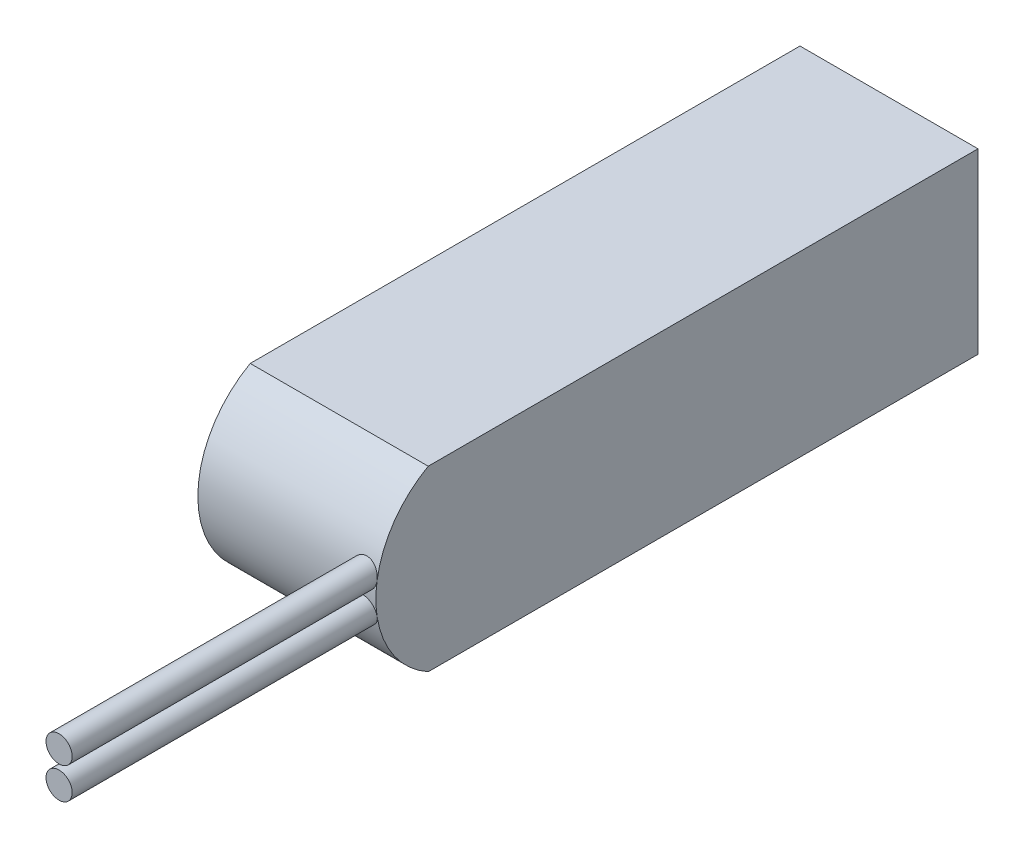
ISO-10303-21;
HEADER;
FILE_DESCRIPTION(('STEP AP214'),'2;1');
FILE_NAME('part.step','',(''),(''),'','','');
FILE_SCHEMA(('AUTOMOTIVE_DESIGN { 1 0 10303 214 1 1 1 1 }'));
ENDSEC;
DATA;
#1=APPLICATION_CONTEXT('core data for automotive mechanical design processes');
#2=APPLICATION_PROTOCOL_DEFINITION('international standard','automotive_design',2000,#1);
#3=PRODUCT_CONTEXT('',#1,'mechanical');
#4=PRODUCT('Part','Part','',(#3));
#5=PRODUCT_RELATED_PRODUCT_CATEGORY('part','',(#4));
#6=PRODUCT_DEFINITION_FORMATION('','',#4);
#7=PRODUCT_DEFINITION_CONTEXT('part definition',#1,'design');
#8=PRODUCT_DEFINITION('design','',#6,#7);
#9=PRODUCT_DEFINITION_SHAPE('','',#8);
#10=(LENGTH_UNIT() NAMED_UNIT(*) SI_UNIT(.MILLI.,.METRE.));
#11=(NAMED_UNIT(*) PLANE_ANGLE_UNIT() SI_UNIT($,.RADIAN.));
#12=(NAMED_UNIT(*) SI_UNIT($,.STERADIAN.) SOLID_ANGLE_UNIT());
#13=UNCERTAINTY_MEASURE_WITH_UNIT(LENGTH_MEASURE(1.E-05),#10,'distance_accuracy_value','');
#14=(GEOMETRIC_REPRESENTATION_CONTEXT(3) GLOBAL_UNCERTAINTY_ASSIGNED_CONTEXT((#13)) GLOBAL_UNIT_ASSIGNED_CONTEXT((#10,
#11,#12)) REPRESENTATION_CONTEXT('',''));
#15=CARTESIAN_POINT('',(0.,0.,0.));
#16=DIRECTION('',(0.,0.,1.));
#17=DIRECTION('',(1.,0.,0.));
#18=AXIS2_PLACEMENT_3D('',#15,#16,#17);
#19=CARTESIAN_POINT('',(0.,0.,105.));
#20=DIRECTION('',(1.,0.,0.));
#21=DIRECTION('',(0.,0.,-1.));
#22=AXIS2_PLACEMENT_3D('',#19,#20,#21);
#23=PLANE('',#22);
#24=DIRECTION('',(0.,-1.,0.));
#25=VECTOR('',#24,1.);
#26=CARTESIAN_POINT('',(0.,0.,0.));
#27=LINE('',#26,#25);
#28=CARTESIAN_POINT('',(0.,34.,0.));
#29=VERTEX_POINT('',#28);
#30=CARTESIAN_POINT('',(0.,0.,0.));
#31=VERTEX_POINT('',#30);
#32=EDGE_CURVE('E112',#29,#31,#27,.T.);
#33=ORIENTED_EDGE('',*,*,#32,.T.);
#34=DIRECTION('',(0.,0.,-1.));
#35=VECTOR('',#34,1.);
#36=CARTESIAN_POINT('',(0.,0.,105.));
#37=LINE('',#36,#35);
#38=CARTESIAN_POINT('',(0.,0.,105.));
#39=VERTEX_POINT('',#38);
#40=EDGE_CURVE('E138',#39,#31,#37,.T.);
#41=ORIENTED_EDGE('',*,*,#40,.F.);
#42=CARTESIAN_POINT('',(0.,17.,95.55));
#43=DIRECTION('',(1.,0.,0.));
#44=DIRECTION('',(0.,0.,-1.));
#45=AXIS2_PLACEMENT_3D('',#42,#43,#44);
#46=CIRCLE('',#45,19.45);
#47=CARTESIAN_POINT('',(0.,34.,105.));
#48=VERTEX_POINT('',#47);
#49=EDGE_CURVE('E111',#48,#39,#46,.T.);
#50=ORIENTED_EDGE('',*,*,#49,.F.);
#51=DIRECTION('',(0.,0.,-1.));
#52=VECTOR('',#51,1.);
#53=CARTESIAN_POINT('',(0.,34.,105.));
#54=LINE('',#53,#52);
#55=EDGE_CURVE('E55',#48,#29,#54,.T.);
#56=ORIENTED_EDGE('',*,*,#55,.T.);
#57=EDGE_LOOP('',(#33,#41,#50,#56));
#58=FACE_BOUND('',#57,.T.);
#59=ADVANCED_FACE('F35',(#58),#23,.F.);
#60=CARTESIAN_POINT('',(0.,0.,105.));
#61=DIRECTION('',(0.,1.,0.));
#62=DIRECTION('',(0.,0.,1.));
#63=AXIS2_PLACEMENT_3D('',#60,#61,#62);
#64=PLANE('',#63);
#65=DIRECTION('',(1.,0.,0.));
#66=VECTOR('',#65,1.);
#67=CARTESIAN_POINT('',(0.,0.,0.));
#68=LINE('',#67,#66);
#69=CARTESIAN_POINT('',(34.,0.,0.));
#70=VERTEX_POINT('',#69);
#71=EDGE_CURVE('E115',#31,#70,#68,.T.);
#72=ORIENTED_EDGE('',*,*,#71,.T.);
#73=DIRECTION('',(0.,0.,-1.));
#74=VECTOR('',#73,1.);
#75=CARTESIAN_POINT('',(34.,0.,105.));
#76=LINE('',#75,#74);
#77=CARTESIAN_POINT('',(34.,0.,105.));
#78=VERTEX_POINT('',#77);
#79=EDGE_CURVE('E142',#78,#70,#76,.T.);
#80=ORIENTED_EDGE('',*,*,#79,.F.);
#81=DIRECTION('',(1.,0.,0.));
#82=VECTOR('',#81,1.);
#83=CARTESIAN_POINT('',(0.,0.,105.));
#84=LINE('',#83,#82);
#85=EDGE_CURVE('E83',#39,#78,#84,.T.);
#86=ORIENTED_EDGE('',*,*,#85,.F.);
#87=ORIENTED_EDGE('',*,*,#40,.T.);
#88=EDGE_LOOP('',(#72,#80,#86,#87));
#89=FACE_BOUND('',#88,.T.);
#90=ADVANCED_FACE('F132',(#89),#64,.F.);
#91=CARTESIAN_POINT('',(34.,0.,105.));
#92=DIRECTION('',(-1.,0.,0.));
#93=DIRECTION('',(0.,0.,1.));
#94=AXIS2_PLACEMENT_3D('',#91,#92,#93);
#95=PLANE('',#94);
#96=CARTESIAN_POINT('',(34.,17.,95.55));
#97=DIRECTION('',(1.,0.,0.));
#98=DIRECTION('',(0.,0.,-1.));
#99=AXIS2_PLACEMENT_3D('',#96,#97,#98);
#100=CIRCLE('',#99,19.45);
#101=CARTESIAN_POINT('',(34.,20.,114.767244859761));
#102=VERTEX_POINT('',#101);
#103=CARTESIAN_POINT('',(34.,14.,114.767244859761));
#104=VERTEX_POINT('',#103);
#105=EDGE_CURVE('E93',#102,#104,#100,.T.);
#106=ORIENTED_EDGE('',*,*,#105,.T.);
#107=EDGE_CURVE('E96',#104,#78,#100,.T.);
#108=ORIENTED_EDGE('',*,*,#107,.T.);
#109=ORIENTED_EDGE('',*,*,#79,.T.);
#110=DIRECTION('',(0.,1.,0.));
#111=VECTOR('',#110,1.);
#112=CARTESIAN_POINT('',(34.,0.,0.));
#113=LINE('',#112,#111);
#114=CARTESIAN_POINT('',(34.,34.,0.));
#115=VERTEX_POINT('',#114);
#116=EDGE_CURVE('E74',#70,#115,#113,.T.);
#117=ORIENTED_EDGE('',*,*,#116,.T.);
#118=DIRECTION('',(0.,0.,-1.));
#119=VECTOR('',#118,1.);
#120=CARTESIAN_POINT('',(34.,34.,105.));
#121=LINE('',#120,#119);
#122=CARTESIAN_POINT('',(34.,34.,105.));
#123=VERTEX_POINT('',#122);
#124=EDGE_CURVE('E145',#123,#115,#121,.T.);
#125=ORIENTED_EDGE('',*,*,#124,.F.);
#126=EDGE_CURVE('E98',#123,#102,#100,.T.);
#127=ORIENTED_EDGE('',*,*,#126,.T.);
#128=EDGE_LOOP('',(#106,#108,#109,#117,#125,#127));
#129=FACE_BOUND('',#128,.T.);
#130=ADVANCED_FACE('F95',(#129),#95,.F.);
#131=CARTESIAN_POINT('',(0.,34.,105.));
#132=DIRECTION('',(0.,-1.,0.));
#133=DIRECTION('',(0.,0.,-1.));
#134=AXIS2_PLACEMENT_3D('',#131,#132,#133);
#135=PLANE('',#134);
#136=DIRECTION('',(-1.,0.,0.));
#137=VECTOR('',#136,1.);
#138=CARTESIAN_POINT('',(0.,34.,0.));
#139=LINE('',#138,#137);
#140=EDGE_CURVE('E77',#115,#29,#139,.T.);
#141=ORIENTED_EDGE('',*,*,#140,.T.);
#142=ORIENTED_EDGE('',*,*,#55,.F.);
#143=DIRECTION('',(-1.,0.,0.));
#144=VECTOR('',#143,1.);
#145=CARTESIAN_POINT('',(0.,34.,105.));
#146=LINE('',#145,#144);
#147=EDGE_CURVE('E246',#123,#48,#146,.T.);
#148=ORIENTED_EDGE('',*,*,#147,.F.);
#149=ORIENTED_EDGE('',*,*,#124,.T.);
#150=EDGE_LOOP('',(#141,#142,#148,#149));
#151=FACE_BOUND('',#150,.T.);
#152=ADVANCED_FACE('F204',(#151),#135,.F.);
#153=CARTESIAN_POINT('',(0.,0.,0.));
#154=DIRECTION('',(0.,0.,-1.));
#155=DIRECTION('',(-1.,0.,0.));
#156=AXIS2_PLACEMENT_3D('',#153,#154,#155);
#157=PLANE('',#156);
#158=ORIENTED_EDGE('',*,*,#140,.F.);
#159=ORIENTED_EDGE('',*,*,#116,.F.);
#160=ORIENTED_EDGE('',*,*,#71,.F.);
#161=ORIENTED_EDGE('',*,*,#32,.F.);
#162=EDGE_LOOP('',(#158,#159,#160,#161));
#163=FACE_BOUND('',#162,.T.);
#164=ADVANCED_FACE('F140',(#163),#157,.T.);
#165=CARTESIAN_POINT('',(0.,17.,95.55));
#166=DIRECTION('',(1.,0.,0.));
#167=DIRECTION('',(0.,0.,-1.));
#168=AXIS2_PLACEMENT_3D('',#165,#166,#167);
#169=CYLINDRICAL_SURFACE('',#168,19.45);
#170=ORIENTED_EDGE('',*,*,#107,.F.);
#171=CARTESIAN_POINT('',(29.,14.,114.767244859761));
#172=CARTESIAN_POINT('',(29.0000062159612,13.857177060345,114.744946476974));
#173=CARTESIAN_POINT('',(29.0122793940831,13.7145062107599,114.721027875421));
#174=CARTESIAN_POINT('',(29.0608227683726,13.4336265470204,114.670771709605));
#175=CARTESIAN_POINT('',(29.0971234660439,13.2954236388413,114.644431107402));
#176=CARTESIAN_POINT('',(29.1925112157584,13.0275377195619,114.59050140482));
#177=CARTESIAN_POINT('',(29.2515748620827,12.897846116599,114.562913612485));
#178=CARTESIAN_POINT('',(29.3908203153266,12.6503626587698,114.507828085392));
#179=CARTESIAN_POINT('',(29.4709979765407,12.5325684741379,114.480330334025));
#180=CARTESIAN_POINT('',(29.6510994283548,12.3111880819764,114.426722011835));
#181=CARTESIAN_POINT('',(29.7511741927137,12.2077214544136,114.400624114219));
#182=CARTESIAN_POINT('',(29.9680500288974,12.0191485064507,114.351678992662));
#183=CARTESIAN_POINT('',(30.084850624646,11.9340416636391,114.328831676235));
#184=CARTESIAN_POINT('',(30.3300618538331,11.7860836108608,114.288286767731));
#185=CARTESIAN_POINT('',(30.4582620181354,11.7229047331532,114.270514130379));
#186=CARTESIAN_POINT('',(30.7241503526188,11.6191584685312,114.240959821331));
#187=CARTESIAN_POINT('',(30.8618360225157,11.5785851484481,114.229176577699));
#188=CARTESIAN_POINT('',(31.1374264269278,11.5225832629358,114.212830207316));
#189=CARTESIAN_POINT('',(31.2751425159777,11.5062970019949,114.208020974578));
#190=CARTESIAN_POINT('',(31.5514315059592,11.4967115599086,114.205196246598));
#191=CARTESIAN_POINT('',(31.6900042668544,11.5034087160201,114.207179668848));
#192=CARTESIAN_POINT('',(31.9607231792232,11.5391157634076,114.217661001615));
#193=CARTESIAN_POINT('',(32.0929438364034,11.5676094562597,114.226008186569));
#194=CARTESIAN_POINT('',(32.3506279295237,11.6453141335468,114.24843471971));
#195=CARTESIAN_POINT('',(32.4760909906343,11.6945262658572,114.262514385495));
#196=CARTESIAN_POINT('',(32.7185819239983,11.8128782738661,114.295668173966));
#197=CARTESIAN_POINT('',(32.8354770730269,11.8822718563786,114.314805580482));
#198=CARTESIAN_POINT('',(33.0560902749017,12.0386549308214,114.356756579939));
#199=CARTESIAN_POINT('',(33.1598059772814,12.1256475542728,114.379570826981));
#200=CARTESIAN_POINT('',(33.3550295215928,12.3182374125962,114.428394855704));
#201=CARTESIAN_POINT('',(33.4459724031222,12.4243860331838,114.454489397485));
#202=CARTESIAN_POINT('',(33.6088619314158,12.6501535720183,114.507710178605));
#203=CARTESIAN_POINT('',(33.6808055617023,12.769774624964,114.53483658099));
#204=CARTESIAN_POINT('',(33.8054364033136,13.022591908808,114.589428861088));
#205=CARTESIAN_POINT('',(33.8575813977391,13.1560579514265,114.616885555379));
#206=CARTESIAN_POINT('',(33.9384017720416,13.4302428459931,114.670115690268));
#207=CARTESIAN_POINT('',(33.9670771207491,13.5709617075731,114.695889128629));
#208=CARTESIAN_POINT('',(33.999912617277,13.8554417214703,114.744661574589));
#209=CARTESIAN_POINT('',(34.0041184812933,13.9991966965647,114.767665677289));
#210=CARTESIAN_POINT('',(33.9877523345134,14.2858046364852,114.810234346463));
#211=CARTESIAN_POINT('',(33.9671830002231,14.4286576970708,114.829799284215));
#212=CARTESIAN_POINT('',(33.9022434868777,14.7065483139646,114.864808960999));
#213=CARTESIAN_POINT('',(33.8583196212972,14.8416814580514,114.880323083483));
#214=CARTESIAN_POINT('',(33.7480594692205,15.1028677635443,114.907702441074));
#215=CARTESIAN_POINT('',(33.6817249578779,15.2289216431624,114.919567965045));
#216=CARTESIAN_POINT('',(33.5295697587151,15.4664448857669,114.939810251214));
#217=CARTESIAN_POINT('',(33.4440368524045,15.5780947462276,114.948233822108));
#218=CARTESIAN_POINT('',(33.2553777373226,15.785583551909,114.962329274802));
#219=CARTESIAN_POINT('',(33.1522518161485,15.88142275554,114.968001201579));
#220=CARTESIAN_POINT('',(32.9316414170577,16.0542604970361,114.977186354807));
#221=CARTESIAN_POINT('',(32.8141968945539,16.1313097408657,114.980705430523));
#222=CARTESIAN_POINT('',(32.5680512273252,16.2646991178389,114.986211252452));
#223=CARTESIAN_POINT('',(32.4393499874738,16.3210390759547,114.988197985715));
#224=CARTESIAN_POINT('',(32.1740387708515,16.4115053567659,114.991148156673));
#225=CARTESIAN_POINT('',(32.0374121598656,16.4455829712887,114.992109353468));
#226=CARTESIAN_POINT('',(31.7603767072301,16.4903599906534,114.99333500106));
#227=CARTESIAN_POINT('',(31.6199678294297,16.5010591719646,114.993599445197));
#228=CARTESIAN_POINT('',(31.3391585361807,16.4987737631479,114.993540663613));
#229=CARTESIAN_POINT('',(31.1987583721123,16.4857581706045,114.993216668626));
#230=CARTESIAN_POINT('',(30.9221353534442,16.4363523684057,114.991846714826));
#231=CARTESIAN_POINT('',(30.785912524661,16.3999620143213,114.990800751552));
#232=CARTESIAN_POINT('',(30.5215096793983,16.3048419565901,114.987631151562));
#233=CARTESIAN_POINT('',(30.3933299750359,16.2461113866447,114.985507473052));
#234=CARTESIAN_POINT('',(30.1486733180398,16.1079961210843,114.979657365635));
#235=CARTESIAN_POINT('',(30.0321958660295,16.0286123073358,114.975931005155));
#236=CARTESIAN_POINT('',(29.814409941794,15.8516074163905,114.966269391545));
#237=CARTESIAN_POINT('',(29.7130808281615,15.7540115708297,114.960337183326));
#238=CARTESIAN_POINT('',(29.5282568982369,15.5433294658733,114.945662797627));
#239=CARTESIAN_POINT('',(29.4447653940629,15.4302403360449,114.936920099044));
#240=CARTESIAN_POINT('',(29.2981110252408,15.1921438565104,114.916166378573));
#241=CARTESIAN_POINT('',(29.2349113947856,15.067158599802,114.904161341285));
#242=CARTESIAN_POINT('',(29.1303669601431,14.8088358920403,114.876616555676));
#243=CARTESIAN_POINT('',(29.08899906135,14.6755074345485,114.861080567557));
#244=CARTESIAN_POINT('',(29.0393675457219,14.451195041591,114.83248294777));
#245=CARTESIAN_POINT('',(29.0246073307151,14.3614655236757,114.820415814041));
#246=CARTESIAN_POINT('',(29.0049216108584,14.1811369619183,114.794864431208));
#247=CARTESIAN_POINT('',(28.9999960595951,14.0905379221817,114.781380188794));
#248=CARTESIAN_POINT('',(29.,14.,114.767244859761));
#249=B_SPLINE_CURVE_WITH_KNOTS('',3,(#171,#172,#173,#174,#175,#176,#177,#178,#179,#180,#181,
#182,#183,#184,#185,#186,#187,#188,#189,#190,#191,#192,#193,#194,#195,#196,#197,#198,#199,#200,
#201,#202,#203,#204,#205,#206,#207,#208,#209,#210,#211,#212,#213,#214,#215,#216,#217,#218,#219,
#220,#221,#222,#223,#224,#225,#226,#227,#228,#229,#230,#231,#232,#233,#234,#235,#236,#237,#238,
#239,#240,#241,#242,#243,#244,#245,#246,#247,#248),.UNSPECIFIED.,.T.,.F.,(4,2,2,2,2,2,2,2,2,2,2,
2,2,2,2,2,2,2,2,2,2,2,2,2,2,2,2,2,2,2,2,2,2,2,2,2,2,2,4),(0.,0.433319880383058,
0.867190892207756,1.30061696671479,1.73395800202502,2.17072203812959,2.6074736448591,
3.03738537010408,3.46718420532487,3.88141223949005,4.29557426343451,4.70022039791289,
5.10488895418156,5.51488252609292,5.92494911531177,6.34959136871602,6.77430100134478,
7.20992213533259,7.64554384785794,8.08035142885637,8.51511204107756,8.94184802680143,
9.36855021856924,9.78923913708408,10.2099211791549,10.629455098529,11.0489925635789,
11.4694448948497,11.8899012462189,12.3109076562337,12.7319166676066,13.1529420063397,
13.5739493707909,13.9943777288948,14.4148840851447,14.8346241907962,15.2539193815767,
15.5286096159067,15.803298553865),.UNSPECIFIED.);
#250=EDGE_CURVE('E11',#104,#104,#249,.T.);
#251=ORIENTED_EDGE('',*,*,#250,.F.);
#252=ORIENTED_EDGE('',*,*,#105,.F.);
#253=CARTESIAN_POINT('',(34.,20.,114.767244859761));
#254=CARTESIAN_POINT('',(33.9999937840388,20.142822939655,114.744946476974));
#255=CARTESIAN_POINT('',(33.9877206059169,20.2854937892401,114.721027875421));
#256=CARTESIAN_POINT('',(33.9391772316274,20.5663734529796,114.670771709605));
#257=CARTESIAN_POINT('',(33.9028765339561,20.7045763611587,114.644431107402));
#258=CARTESIAN_POINT('',(33.8074887842416,20.9724622804381,114.59050140482));
#259=CARTESIAN_POINT('',(33.7484251379173,21.102153883401,114.562913612485));
#260=CARTESIAN_POINT('',(33.6091796846734,21.3496373412302,114.507828085392));
#261=CARTESIAN_POINT('',(33.5290020234594,21.4674315258621,114.480330334025));
#262=CARTESIAN_POINT('',(33.3489005716452,21.6888119180236,114.426722011835));
#263=CARTESIAN_POINT('',(33.2488258072863,21.7922785455864,114.400624114219));
#264=CARTESIAN_POINT('',(33.0319499711026,21.9808514935493,114.351678992662));
#265=CARTESIAN_POINT('',(32.915149375354,22.0659583363609,114.328831676235));
#266=CARTESIAN_POINT('',(32.6699381461669,22.2139163891392,114.288286767731));
#267=CARTESIAN_POINT('',(32.5417379818646,22.2770952668468,114.270514130379));
#268=CARTESIAN_POINT('',(32.2758496473812,22.3808415314688,114.240959821331));
#269=CARTESIAN_POINT('',(32.1381639774843,22.421414851552,114.229176577699));
#270=CARTESIAN_POINT('',(31.8625735730722,22.4774167370642,114.212830207316));
#271=CARTESIAN_POINT('',(31.7248574840223,22.4937029980051,114.208020974578));
#272=CARTESIAN_POINT('',(31.4485684940408,22.5032884400914,114.205196246598));
#273=CARTESIAN_POINT('',(31.3099957331456,22.4965912839799,114.207179668848));
#274=CARTESIAN_POINT('',(31.0392768207768,22.4608842365924,114.217661001615));
#275=CARTESIAN_POINT('',(30.9070561635966,22.4323905437403,114.226008186569));
#276=CARTESIAN_POINT('',(30.6493720704763,22.3546858664532,114.24843471971));
#277=CARTESIAN_POINT('',(30.5239090093657,22.3054737341428,114.262514385495));
#278=CARTESIAN_POINT('',(30.2814180760017,22.1871217261339,114.295668173966));
#279=CARTESIAN_POINT('',(30.1645229269731,22.1177281436214,114.314805580482));
#280=CARTESIAN_POINT('',(29.9439097250983,21.9613450691786,114.356756579939));
#281=CARTESIAN_POINT('',(29.8401940227186,21.8743524457272,114.379570826981));
#282=CARTESIAN_POINT('',(29.6449704784072,21.6817625874038,114.428394855704));
#283=CARTESIAN_POINT('',(29.5540275968778,21.5756139668162,114.454489397485));
#284=CARTESIAN_POINT('',(29.3911380685842,21.3498464279817,114.507710178605));
#285=CARTESIAN_POINT('',(29.3191944382977,21.230225375036,114.53483658099));
#286=CARTESIAN_POINT('',(29.1945635966864,20.977408091192,114.589428861088));
#287=CARTESIAN_POINT('',(29.1424186022609,20.8439420485735,114.616885555379));
#288=CARTESIAN_POINT('',(29.0615982279584,20.5697571540069,114.670115690268));
#289=CARTESIAN_POINT('',(29.0329228792509,20.4290382924269,114.695889128629));
#290=CARTESIAN_POINT('',(29.000087382723,20.1445582785297,114.744661574589));
#291=CARTESIAN_POINT('',(28.9958815187067,20.0008033034353,114.767665677289));
#292=CARTESIAN_POINT('',(29.0122476654867,19.7141953635148,114.810234346463));
#293=CARTESIAN_POINT('',(29.0328169997769,19.5713423029292,114.829799284215));
#294=CARTESIAN_POINT('',(29.0977565131223,19.2934516860354,114.864808960999));
#295=CARTESIAN_POINT('',(29.1416803787028,19.1583185419486,114.880323083483));
#296=CARTESIAN_POINT('',(29.2519405307795,18.8971322364557,114.907702441074));
#297=CARTESIAN_POINT('',(29.3182750421221,18.7710783568376,114.919567965045));
#298=CARTESIAN_POINT('',(29.4704302412849,18.5335551142331,114.939810251214));
#299=CARTESIAN_POINT('',(29.5559631475955,18.4219052537724,114.948233822108));
#300=CARTESIAN_POINT('',(29.7446222626774,18.214416448091,114.962329274802));
#301=CARTESIAN_POINT('',(29.8477481838515,18.11857724446,114.968001201579));
#302=CARTESIAN_POINT('',(30.0683585829423,17.945739502964,114.977186354807));
#303=CARTESIAN_POINT('',(30.1858031054461,17.8686902591343,114.980705430523));
#304=CARTESIAN_POINT('',(30.4319487726748,17.7353008821611,114.986211252452));
#305=CARTESIAN_POINT('',(30.5606500125261,17.6789609240453,114.988197985715));
#306=CARTESIAN_POINT('',(30.8259612291485,17.5884946432341,114.991148156673));
#307=CARTESIAN_POINT('',(30.9625878401344,17.5544170287113,114.992109353468));
#308=CARTESIAN_POINT('',(31.2396232927699,17.5096400093466,114.99333500106));
#309=CARTESIAN_POINT('',(31.3800321705703,17.4989408280354,114.993599445197));
#310=CARTESIAN_POINT('',(31.6608414638193,17.5012262368521,114.993540663613));
#311=CARTESIAN_POINT('',(31.8012416278877,17.5142418293955,114.993216668626));
#312=CARTESIAN_POINT('',(32.0778646465558,17.5636476315943,114.991846714826));
#313=CARTESIAN_POINT('',(32.214087475339,17.6000379856787,114.990800751552));
#314=CARTESIAN_POINT('',(32.4784903206017,17.6951580434099,114.987631151562));
#315=CARTESIAN_POINT('',(32.6066700249641,17.7538886133553,114.985507473052));
#316=CARTESIAN_POINT('',(32.8513266819602,17.8920038789157,114.979657365635));
#317=CARTESIAN_POINT('',(32.9678041339705,17.9713876926642,114.975931005155));
#318=CARTESIAN_POINT('',(33.185590058206,18.1483925836095,114.966269391545));
#319=CARTESIAN_POINT('',(33.2869191718385,18.2459884291703,114.960337183326));
#320=CARTESIAN_POINT('',(33.4717431017631,18.4566705341267,114.945662797627));
#321=CARTESIAN_POINT('',(33.5552346059371,18.5697596639551,114.936920099044));
#322=CARTESIAN_POINT('',(33.7018889747592,18.8078561434896,114.916166378573));
#323=CARTESIAN_POINT('',(33.7650886052144,18.932841400198,114.904161341285));
#324=CARTESIAN_POINT('',(33.8696330398569,19.1911641079597,114.876616555676));
#325=CARTESIAN_POINT('',(33.91100093865,19.3244925654515,114.861080567557));
#326=CARTESIAN_POINT('',(33.9606324542781,19.548804958409,114.83248294777));
#327=CARTESIAN_POINT('',(33.9753926692849,19.6385344763243,114.820415814041));
#328=CARTESIAN_POINT('',(33.9950783891416,19.8188630380817,114.794864431208));
#329=CARTESIAN_POINT('',(34.0000039404049,19.9094620778183,114.781380188794));
#330=CARTESIAN_POINT('',(34.,20.,114.767244859761));
#331=B_SPLINE_CURVE_WITH_KNOTS('',3,(#253,#254,#255,#256,#257,#258,#259,#260,#261,#262,#263,
#264,#265,#266,#267,#268,#269,#270,#271,#272,#273,#274,#275,#276,#277,#278,#279,#280,#281,#282,
#283,#284,#285,#286,#287,#288,#289,#290,#291,#292,#293,#294,#295,#296,#297,#298,#299,#300,#301,
#302,#303,#304,#305,#306,#307,#308,#309,#310,#311,#312,#313,#314,#315,#316,#317,#318,#319,#320,
#321,#322,#323,#324,#325,#326,#327,#328,#329,#330),.UNSPECIFIED.,.T.,.F.,(4,2,2,2,2,2,2,2,2,2,2,
2,2,2,2,2,2,2,2,2,2,2,2,2,2,2,2,2,2,2,2,2,2,2,2,2,2,2,4),(0.,0.43331988038306,0.867190892207757,
1.30061696671479,1.73395800202503,2.17072203812959,2.6074736448591,3.03738537010409,
3.46718420532486,3.88141223949005,4.2955742634345,4.70022039791287,5.10488895418155,
5.51488252609292,5.92494911531177,6.34959136871602,6.77430100134479,7.20992213533259,
7.64554384785794,8.08035142885637,8.51511204107756,8.94184802680142,9.36855021856924,
9.78923913708407,10.2099211791549,10.629455098529,11.0489925635789,11.4694448948497,
11.8899012462189,12.3109076562337,12.7319166676066,13.1529420063397,13.5739493707909,
13.9943777288948,14.4148840851447,14.8346241907963,15.2539193815767,15.5286096159067,
15.803298553865),.UNSPECIFIED.);
#332=EDGE_CURVE('E47',#102,#102,#331,.T.);
#333=ORIENTED_EDGE('',*,*,#332,.F.);
#334=ORIENTED_EDGE('',*,*,#126,.F.);
#335=ORIENTED_EDGE('',*,*,#147,.T.);
#336=ORIENTED_EDGE('',*,*,#49,.T.);
#337=ORIENTED_EDGE('',*,*,#85,.T.);
#338=EDGE_LOOP('',(#170,#251,#252,#333,#334,#335,#336,#337));
#339=FACE_BOUND('',#338,.T.);
#340=ADVANCED_FACE('F103',(#339),#169,.T.);
#341=CARTESIAN_POINT('',(31.5,20.,173.));
#342=DIRECTION('',(0.,0.,-1.));
#343=DIRECTION('',(-1.,0.,0.));
#344=AXIS2_PLACEMENT_3D('',#341,#342,#343);
#345=CYLINDRICAL_SURFACE('',#344,2.5);
#346=ORIENTED_EDGE('',*,*,#332,.T.);
#347=EDGE_LOOP('',(#346));
#348=FACE_BOUND('',#347,.T.);
#349=CARTESIAN_POINT('',(31.5,20.,173.));
#350=DIRECTION('',(0.,0.,-1.));
#351=DIRECTION('',(-1.,0.,0.));
#352=AXIS2_PLACEMENT_3D('',#349,#350,#351);
#353=CIRCLE('',#352,2.5);
#354=CARTESIAN_POINT('',(29.,20.,173.));
#355=VERTEX_POINT('',#354);
#356=EDGE_CURVE('E105',#355,#355,#353,.T.);
#357=ORIENTED_EDGE('',*,*,#356,.T.);
#358=EDGE_LOOP('',(#357));
#359=FACE_BOUND('',#358,.T.);
#360=ADVANCED_FACE('F153',(#348,#359),#345,.T.);
#361=CARTESIAN_POINT('',(31.5,20.,173.));
#362=DIRECTION('',(0.,0.,-1.));
#363=DIRECTION('',(-1.,0.,0.));
#364=AXIS2_PLACEMENT_3D('',#361,#362,#363);
#365=PLANE('',#364);
#366=ORIENTED_EDGE('',*,*,#356,.F.);
#367=EDGE_LOOP('',(#366));
#368=FACE_BOUND('',#367,.T.);
#369=ADVANCED_FACE('F129',(#368),#365,.F.);
#370=CARTESIAN_POINT('',(31.5,14.,173.));
#371=DIRECTION('',(0.,0.,-1.));
#372=DIRECTION('',(-1.,0.,0.));
#373=AXIS2_PLACEMENT_3D('',#370,#371,#372);
#374=CYLINDRICAL_SURFACE('',#373,2.5);
#375=ORIENTED_EDGE('',*,*,#250,.T.);
#376=EDGE_LOOP('',(#375));
#377=FACE_BOUND('',#376,.T.);
#378=CARTESIAN_POINT('',(31.5,14.,173.));
#379=DIRECTION('',(0.,0.,-1.));
#380=DIRECTION('',(-1.,0.,0.));
#381=AXIS2_PLACEMENT_3D('',#378,#379,#380);
#382=CIRCLE('',#381,2.5);
#383=CARTESIAN_POINT('',(29.,14.,173.));
#384=VERTEX_POINT('',#383);
#385=EDGE_CURVE('E107',#384,#384,#382,.T.);
#386=ORIENTED_EDGE('',*,*,#385,.T.);
#387=EDGE_LOOP('',(#386));
#388=FACE_BOUND('',#387,.T.);
#389=ADVANCED_FACE('F121',(#377,#388),#374,.T.);
#390=CARTESIAN_POINT('',(31.5,14.,173.));
#391=DIRECTION('',(0.,0.,-1.));
#392=DIRECTION('',(-1.,0.,0.));
#393=AXIS2_PLACEMENT_3D('',#390,#391,#392);
#394=PLANE('',#393);
#395=ORIENTED_EDGE('',*,*,#385,.F.);
#396=EDGE_LOOP('',(#395));
#397=FACE_BOUND('',#396,.T.);
#398=ADVANCED_FACE('F123',(#397),#394,.F.);
#399=CLOSED_SHELL('',(#59,#90,#130,#152,#164,#340,#360,#369,#389,#398));
#400=MANIFOLD_SOLID_BREP('B2',#399);
#401=ADVANCED_BREP_SHAPE_REPRESENTATION('',(#18,#400),#14);
#402=SHAPE_DEFINITION_REPRESENTATION(#9,#401);
ENDSEC;
END-ISO-10303-21;
